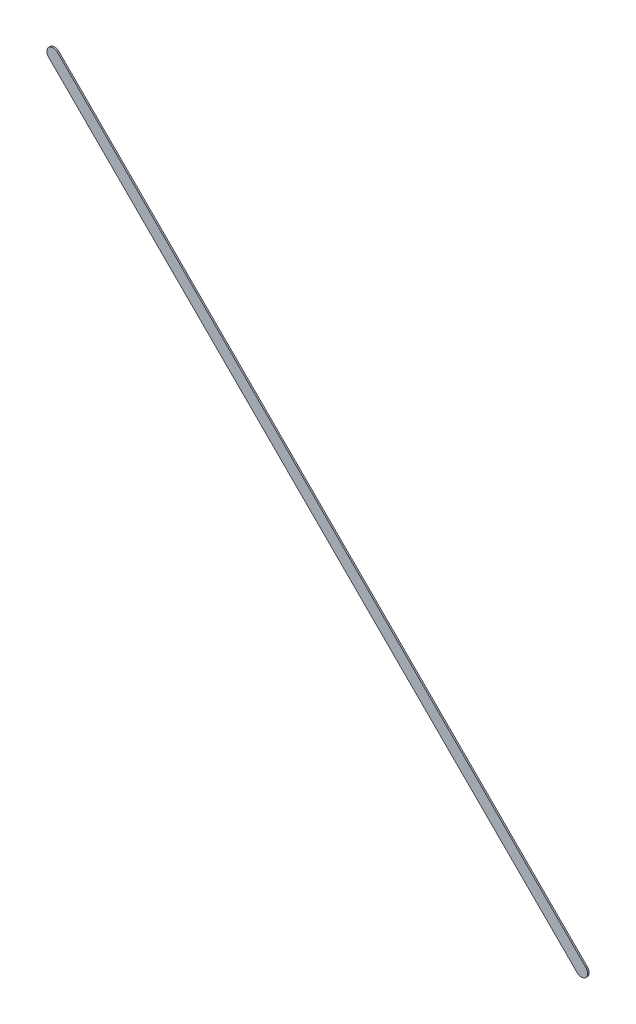
ISO-10303-21;
HEADER;
FILE_DESCRIPTION(('STEP AP214'),'2;1');
FILE_NAME('part.step','',(''),(''),'','','');
FILE_SCHEMA(('AUTOMOTIVE_DESIGN { 1 0 10303 214 1 1 1 1 }'));
ENDSEC;
DATA;
#1=APPLICATION_CONTEXT('core data for automotive mechanical design processes');
#2=APPLICATION_PROTOCOL_DEFINITION('international standard','automotive_design',2000,#1);
#3=PRODUCT_CONTEXT('',#1,'mechanical');
#4=PRODUCT('Part','Part','',(#3));
#5=PRODUCT_RELATED_PRODUCT_CATEGORY('part','',(#4));
#6=PRODUCT_DEFINITION_FORMATION('','',#4);
#7=PRODUCT_DEFINITION_CONTEXT('part definition',#1,'design');
#8=PRODUCT_DEFINITION('design','',#6,#7);
#9=PRODUCT_DEFINITION_SHAPE('','',#8);
#10=(LENGTH_UNIT() NAMED_UNIT(*) SI_UNIT(.MILLI.,.METRE.));
#11=(NAMED_UNIT(*) PLANE_ANGLE_UNIT() SI_UNIT($,.RADIAN.));
#12=(NAMED_UNIT(*) SI_UNIT($,.STERADIAN.) SOLID_ANGLE_UNIT());
#13=UNCERTAINTY_MEASURE_WITH_UNIT(LENGTH_MEASURE(1.E-05),#10,'distance_accuracy_value','');
#14=(GEOMETRIC_REPRESENTATION_CONTEXT(3) GLOBAL_UNCERTAINTY_ASSIGNED_CONTEXT((#13)) GLOBAL_UNIT_ASSIGNED_CONTEXT((#10,
#11,#12)) REPRESENTATION_CONTEXT('',''));
#15=CARTESIAN_POINT('',(0.,0.,0.));
#16=DIRECTION('',(0.,0.,1.));
#17=DIRECTION('',(1.,0.,0.));
#18=AXIS2_PLACEMENT_3D('',#15,#16,#17);
#19=CARTESIAN_POINT('',(130.143933,-68.816066,1.635));
#20=DIRECTION('',(0.,0.,1.));
#21=DIRECTION('',(1.,0.,0.));
#22=AXIS2_PLACEMENT_3D('',#19,#20,#21);
#23=PLANE('',#22);
#24=DIRECTION('',(0.707106781186548,-0.707106781186548,0.));
#25=VECTOR('',#24,1.);
#26=CARTESIAN_POINT('',(130.143933,-68.816066,1.635));
#27=LINE('',#26,#25);
#28=CARTESIAN_POINT('',(130.143933,-68.816066,1.635));
#29=VERTEX_POINT('',#28);
#30=CARTESIAN_POINT('',(142.893933,-81.566066,1.635));
#31=VERTEX_POINT('',#30);
#32=EDGE_CURVE('E88',#29,#31,#27,.T.);
#33=ORIENTED_EDGE('',*,*,#32,.T.);
#34=CARTESIAN_POINT('',(142.9999995,-81.4599995,1.635));
#35=DIRECTION('',(0.,0.,1.));
#36=DIRECTION('',(-0.707106781186548,-0.707106781186548,0.));
#37=AXIS2_PLACEMENT_3D('',#34,#35,#36);
#38=CIRCLE('',#37,0.150000682813);
#39=CARTESIAN_POINT('',(143.106066,-81.353933,1.635));
#40=VERTEX_POINT('',#39);
#41=EDGE_CURVE('E83',#31,#40,#38,.T.);
#42=ORIENTED_EDGE('',*,*,#41,.T.);
#43=DIRECTION('',(-0.707106781186548,0.707106781186548,0.));
#44=VECTOR('',#43,1.);
#45=CARTESIAN_POINT('',(143.106066,-81.353933,1.635));
#46=LINE('',#45,#44);
#47=CARTESIAN_POINT('',(130.356066,-68.603933,1.635));
#48=VERTEX_POINT('',#47);
#49=EDGE_CURVE('E21',#40,#48,#46,.T.);
#50=ORIENTED_EDGE('',*,*,#49,.T.);
#51=CARTESIAN_POINT('',(130.2499995,-68.7099995,1.635));
#52=DIRECTION('',(0.,0.,1.));
#53=DIRECTION('',(0.707106781186548,0.707106781186548,0.));
#54=AXIS2_PLACEMENT_3D('',#51,#52,#53);
#55=CIRCLE('',#54,0.150000682813);
#56=EDGE_CURVE('E11',#48,#29,#55,.T.);
#57=ORIENTED_EDGE('',*,*,#56,.T.);
#58=EDGE_LOOP('',(#33,#42,#50,#57));
#59=FACE_BOUND('',#58,.T.);
#60=ADVANCED_FACE('F17',(#59),#23,.T.);
#61=CARTESIAN_POINT('',(130.143933,-68.816066,1.6));
#62=DIRECTION('',(0.,0.,1.));
#63=DIRECTION('',(1.,0.,0.));
#64=AXIS2_PLACEMENT_3D('',#61,#62,#63);
#65=PLANE('',#64);
#66=CARTESIAN_POINT('',(130.2499995,-68.7099995,1.6));
#67=DIRECTION('',(0.,0.,1.));
#68=DIRECTION('',(0.707106781186548,0.707106781186548,0.));
#69=AXIS2_PLACEMENT_3D('',#66,#67,#68);
#70=CIRCLE('',#69,0.150000682813);
#71=CARTESIAN_POINT('',(130.356066,-68.603933,1.6));
#72=VERTEX_POINT('',#71);
#73=CARTESIAN_POINT('',(130.143933,-68.816066,1.6));
#74=VERTEX_POINT('',#73);
#75=EDGE_CURVE('E28',#72,#74,#70,.T.);
#76=ORIENTED_EDGE('',*,*,#75,.F.);
#77=DIRECTION('',(-0.707106781186548,0.707106781186548,0.));
#78=VECTOR('',#77,1.);
#79=CARTESIAN_POINT('',(143.106066,-81.353933,1.6));
#80=LINE('',#79,#78);
#81=CARTESIAN_POINT('',(143.106066,-81.353933,1.6));
#82=VERTEX_POINT('',#81);
#83=EDGE_CURVE('E71',#82,#72,#80,.T.);
#84=ORIENTED_EDGE('',*,*,#83,.F.);
#85=CARTESIAN_POINT('',(142.9999995,-81.4599995,1.6));
#86=DIRECTION('',(0.,0.,1.));
#87=DIRECTION('',(-0.707106781186548,-0.707106781186548,0.));
#88=AXIS2_PLACEMENT_3D('',#85,#86,#87);
#89=CIRCLE('',#88,0.150000682813);
#90=CARTESIAN_POINT('',(142.893933,-81.566066,1.6));
#91=VERTEX_POINT('',#90);
#92=EDGE_CURVE('E66',#91,#82,#89,.T.);
#93=ORIENTED_EDGE('',*,*,#92,.F.);
#94=DIRECTION('',(0.707106781186548,-0.707106781186548,0.));
#95=VECTOR('',#94,1.);
#96=CARTESIAN_POINT('',(130.143933,-68.816066,1.6));
#97=LINE('',#96,#95);
#98=EDGE_CURVE('E69',#74,#91,#97,.T.);
#99=ORIENTED_EDGE('',*,*,#98,.F.);
#100=EDGE_LOOP('',(#76,#84,#93,#99));
#101=FACE_BOUND('',#100,.T.);
#102=ADVANCED_FACE('F19',(#101),#65,.F.);
#103=CARTESIAN_POINT('',(130.2499995,-68.7099995,1.6));
#104=DIRECTION('',(0.,0.,-1.));
#105=DIRECTION('',(0.707106781186548,0.707106781186548,0.));
#106=AXIS2_PLACEMENT_3D('',#103,#104,#105);
#107=CYLINDRICAL_SURFACE('',#106,0.150000682813);
#108=ORIENTED_EDGE('',*,*,#75,.T.);
#109=DIRECTION('',(0.,0.,1.));
#110=VECTOR('',#109,1.);
#111=CARTESIAN_POINT('',(130.143933,-68.816066,1.6));
#112=LINE('',#111,#110);
#113=EDGE_CURVE('E77',#74,#29,#112,.T.);
#114=ORIENTED_EDGE('',*,*,#113,.T.);
#115=ORIENTED_EDGE('',*,*,#56,.F.);
#116=DIRECTION('',(0.,0.,1.));
#117=VECTOR('',#116,1.);
#118=CARTESIAN_POINT('',(130.356066,-68.603933,1.6));
#119=LINE('',#118,#117);
#120=EDGE_CURVE('E110',#72,#48,#119,.T.);
#121=ORIENTED_EDGE('',*,*,#120,.F.);
#122=EDGE_LOOP('',(#108,#114,#115,#121));
#123=FACE_BOUND('',#122,.T.);
#124=ADVANCED_FACE('F178',(#123),#107,.T.);
#125=CARTESIAN_POINT('',(143.106066,-81.353933,1.6));
#126=DIRECTION('',(-0.707106781186548,-0.707106781186548,0.));
#127=DIRECTION('',(-0.707106781186548,0.707106781186548,0.));
#128=AXIS2_PLACEMENT_3D('',#125,#126,#127);
#129=PLANE('',#128);
#130=ORIENTED_EDGE('',*,*,#83,.T.);
#131=ORIENTED_EDGE('',*,*,#120,.T.);
#132=ORIENTED_EDGE('',*,*,#49,.F.);
#133=DIRECTION('',(0.,0.,1.));
#134=VECTOR('',#133,1.);
#135=CARTESIAN_POINT('',(143.106066,-81.353933,1.6));
#136=LINE('',#135,#134);
#137=EDGE_CURVE('E76',#82,#40,#136,.T.);
#138=ORIENTED_EDGE('',*,*,#137,.F.);
#139=EDGE_LOOP('',(#130,#131,#132,#138));
#140=FACE_BOUND('',#139,.T.);
#141=ADVANCED_FACE('F121',(#140),#129,.F.);
#142=CARTESIAN_POINT('',(142.9999995,-81.4599995,1.6));
#143=DIRECTION('',(0.,0.,-1.));
#144=DIRECTION('',(-0.707106781186548,-0.707106781186548,0.));
#145=AXIS2_PLACEMENT_3D('',#142,#143,#144);
#146=CYLINDRICAL_SURFACE('',#145,0.150000682813);
#147=ORIENTED_EDGE('',*,*,#92,.T.);
#148=ORIENTED_EDGE('',*,*,#137,.T.);
#149=ORIENTED_EDGE('',*,*,#41,.F.);
#150=DIRECTION('',(0.,0.,1.));
#151=VECTOR('',#150,1.);
#152=CARTESIAN_POINT('',(142.893933,-81.566066,1.6));
#153=LINE('',#152,#151);
#154=EDGE_CURVE('E80',#91,#31,#153,.T.);
#155=ORIENTED_EDGE('',*,*,#154,.F.);
#156=EDGE_LOOP('',(#147,#148,#149,#155));
#157=FACE_BOUND('',#156,.T.);
#158=ADVANCED_FACE('F81',(#157),#146,.T.);
#159=CARTESIAN_POINT('',(130.143933,-68.816066,1.6));
#160=DIRECTION('',(0.707106781186548,0.707106781186548,0.));
#161=DIRECTION('',(0.,0.,-1.));
#162=AXIS2_PLACEMENT_3D('',#159,#160,#161);
#163=PLANE('',#162);
#164=ORIENTED_EDGE('',*,*,#98,.T.);
#165=ORIENTED_EDGE('',*,*,#154,.T.);
#166=ORIENTED_EDGE('',*,*,#32,.F.);
#167=ORIENTED_EDGE('',*,*,#113,.F.);
#168=EDGE_LOOP('',(#164,#165,#166,#167));
#169=FACE_BOUND('',#168,.T.);
#170=ADVANCED_FACE('F91',(#169),#163,.F.);
#171=CLOSED_SHELL('',(#60,#102,#124,#141,#158,#170));
#172=MANIFOLD_SOLID_BREP('B1',#171);
#173=ADVANCED_BREP_SHAPE_REPRESENTATION('',(#18,#172),#14);
#174=SHAPE_DEFINITION_REPRESENTATION(#9,#173);
ENDSEC;
END-ISO-10303-21;
